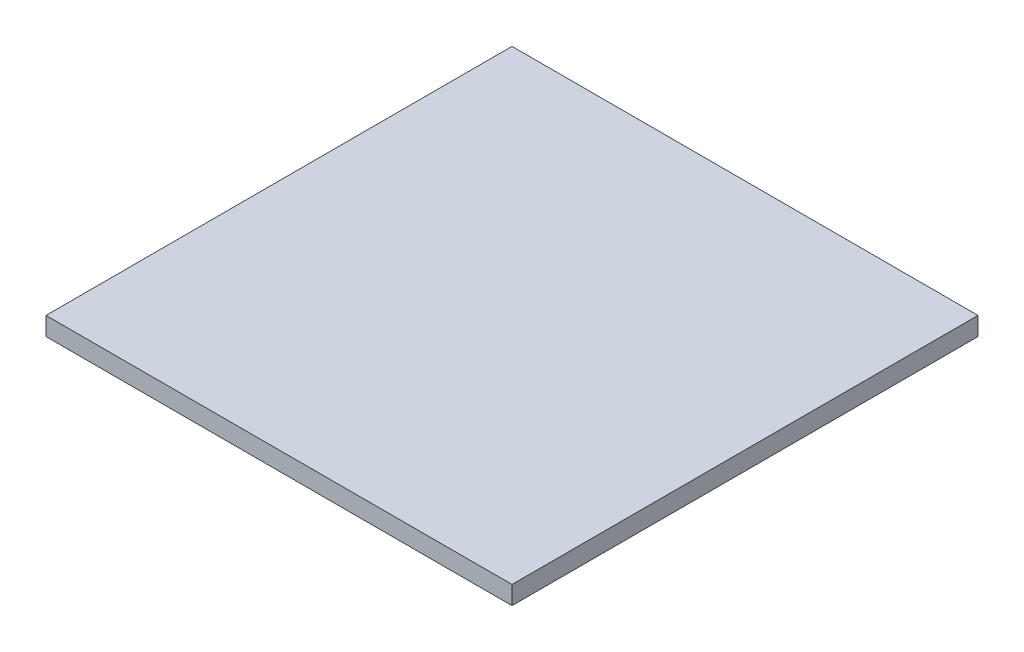
ISO-10303-21;
HEADER;
FILE_DESCRIPTION(('STEP AP214'),'2;1');
FILE_NAME('part.step','',(''),(''),'','','');
FILE_SCHEMA(('AUTOMOTIVE_DESIGN { 1 0 10303 214 1 1 1 1 }'));
ENDSEC;
DATA;
#1=APPLICATION_CONTEXT('core data for automotive mechanical design processes');
#2=APPLICATION_PROTOCOL_DEFINITION('international standard','automotive_design',2000,#1);
#3=PRODUCT_CONTEXT('',#1,'mechanical');
#4=PRODUCT('Part','Part','',(#3));
#5=PRODUCT_RELATED_PRODUCT_CATEGORY('part','',(#4));
#6=PRODUCT_DEFINITION_FORMATION('','',#4);
#7=PRODUCT_DEFINITION_CONTEXT('part definition',#1,'design');
#8=PRODUCT_DEFINITION('design','',#6,#7);
#9=PRODUCT_DEFINITION_SHAPE('','',#8);
#10=(LENGTH_UNIT() NAMED_UNIT(*) SI_UNIT(.MILLI.,.METRE.));
#11=(NAMED_UNIT(*) PLANE_ANGLE_UNIT() SI_UNIT($,.RADIAN.));
#12=(NAMED_UNIT(*) SI_UNIT($,.STERADIAN.) SOLID_ANGLE_UNIT());
#13=UNCERTAINTY_MEASURE_WITH_UNIT(LENGTH_MEASURE(1.E-05),#10,'distance_accuracy_value','');
#14=(GEOMETRIC_REPRESENTATION_CONTEXT(3) GLOBAL_UNCERTAINTY_ASSIGNED_CONTEXT((#13)) GLOBAL_UNIT_ASSIGNED_CONTEXT((#10,
#11,#12)) REPRESENTATION_CONTEXT('',''));
#15=CARTESIAN_POINT('',(0.,0.,0.));
#16=DIRECTION('',(0.,0.,1.));
#17=DIRECTION('',(1.,0.,0.));
#18=AXIS2_PLACEMENT_3D('',#15,#16,#17);
#19=CARTESIAN_POINT('',(38.1,-3.,38.1));
#20=DIRECTION('',(1.,0.,0.));
#21=DIRECTION('',(0.,0.,-1.));
#22=AXIS2_PLACEMENT_3D('',#19,#20,#21);
#23=PLANE('',#22);
#24=DIRECTION('',(0.,0.,-1.));
#25=VECTOR('',#24,1.);
#26=CARTESIAN_POINT('',(38.1,0.,38.1));
#27=LINE('',#26,#25);
#28=CARTESIAN_POINT('',(38.1,0.,38.1));
#29=VERTEX_POINT('',#28);
#30=CARTESIAN_POINT('',(38.1,0.,-38.1));
#31=VERTEX_POINT('',#30);
#32=EDGE_CURVE('E103',#29,#31,#27,.T.);
#33=ORIENTED_EDGE('',*,*,#32,.F.);
#34=DIRECTION('',(0.,1.,0.));
#35=VECTOR('',#34,1.);
#36=CARTESIAN_POINT('',(38.1,-3.,38.1));
#37=LINE('',#36,#35);
#38=CARTESIAN_POINT('',(38.1,-3.,38.1));
#39=VERTEX_POINT('',#38);
#40=EDGE_CURVE('E11',#39,#29,#37,.T.);
#41=ORIENTED_EDGE('',*,*,#40,.F.);
#42=DIRECTION('',(0.,0.,-1.));
#43=VECTOR('',#42,1.);
#44=CARTESIAN_POINT('',(38.1,-3.,38.1));
#45=LINE('',#44,#43);
#46=CARTESIAN_POINT('',(38.1,-3.,-38.1));
#47=VERTEX_POINT('',#46);
#48=EDGE_CURVE('E97',#39,#47,#45,.T.);
#49=ORIENTED_EDGE('',*,*,#48,.T.);
#50=DIRECTION('',(0.,1.,0.));
#51=VECTOR('',#50,1.);
#52=CARTESIAN_POINT('',(38.1,-3.,-38.1));
#53=LINE('',#52,#51);
#54=EDGE_CURVE('E42',#47,#31,#53,.T.);
#55=ORIENTED_EDGE('',*,*,#54,.T.);
#56=EDGE_LOOP('',(#33,#41,#49,#55));
#57=FACE_BOUND('',#56,.T.);
#58=ADVANCED_FACE('F39',(#57),#23,.T.);
#59=CARTESIAN_POINT('',(-38.1,-3.,38.1));
#60=DIRECTION('',(0.,0.,1.));
#61=DIRECTION('',(1.,0.,0.));
#62=AXIS2_PLACEMENT_3D('',#59,#60,#61);
#63=PLANE('',#62);
#64=DIRECTION('',(1.,0.,0.));
#65=VECTOR('',#64,1.);
#66=CARTESIAN_POINT('',(-38.1,0.,38.1));
#67=LINE('',#66,#65);
#68=CARTESIAN_POINT('',(-38.1,0.,38.1));
#69=VERTEX_POINT('',#68);
#70=EDGE_CURVE('E99',#69,#29,#67,.T.);
#71=ORIENTED_EDGE('',*,*,#70,.F.);
#72=DIRECTION('',(0.,1.,0.));
#73=VECTOR('',#72,1.);
#74=CARTESIAN_POINT('',(-38.1,-3.,38.1));
#75=LINE('',#74,#73);
#76=CARTESIAN_POINT('',(-38.1,-3.,38.1));
#77=VERTEX_POINT('',#76);
#78=EDGE_CURVE('E48',#77,#69,#75,.T.);
#79=ORIENTED_EDGE('',*,*,#78,.F.);
#80=DIRECTION('',(1.,0.,0.));
#81=VECTOR('',#80,1.);
#82=CARTESIAN_POINT('',(-38.1,-3.,38.1));
#83=LINE('',#82,#81);
#84=EDGE_CURVE('E94',#77,#39,#83,.T.);
#85=ORIENTED_EDGE('',*,*,#84,.T.);
#86=ORIENTED_EDGE('',*,*,#40,.T.);
#87=EDGE_LOOP('',(#71,#79,#85,#86));
#88=FACE_BOUND('',#87,.T.);
#89=ADVANCED_FACE('F113',(#88),#63,.T.);
#90=CARTESIAN_POINT('',(-38.1,-3.,38.1));
#91=DIRECTION('',(-1.,0.,0.));
#92=DIRECTION('',(0.,0.,1.));
#93=AXIS2_PLACEMENT_3D('',#90,#91,#92);
#94=PLANE('',#93);
#95=DIRECTION('',(0.,0.,1.));
#96=VECTOR('',#95,1.);
#97=CARTESIAN_POINT('',(-38.1,0.,38.1));
#98=LINE('',#97,#96);
#99=CARTESIAN_POINT('',(-38.1,0.,-38.1));
#100=VERTEX_POINT('',#99);
#101=EDGE_CURVE('E89',#100,#69,#98,.T.);
#102=ORIENTED_EDGE('',*,*,#101,.F.);
#103=DIRECTION('',(0.,1.,0.));
#104=VECTOR('',#103,1.);
#105=CARTESIAN_POINT('',(-38.1,-3.,-38.1));
#106=LINE('',#105,#104);
#107=CARTESIAN_POINT('',(-38.1,-3.,-38.1));
#108=VERTEX_POINT('',#107);
#109=EDGE_CURVE('E84',#108,#100,#106,.T.);
#110=ORIENTED_EDGE('',*,*,#109,.F.);
#111=DIRECTION('',(0.,0.,1.));
#112=VECTOR('',#111,1.);
#113=CARTESIAN_POINT('',(-38.1,-3.,38.1));
#114=LINE('',#113,#112);
#115=EDGE_CURVE('E87',#108,#77,#114,.T.);
#116=ORIENTED_EDGE('',*,*,#115,.T.);
#117=ORIENTED_EDGE('',*,*,#78,.T.);
#118=EDGE_LOOP('',(#102,#110,#116,#117));
#119=FACE_BOUND('',#118,.T.);
#120=ADVANCED_FACE('F86',(#119),#94,.T.);
#121=CARTESIAN_POINT('',(-38.1,-3.,-38.1));
#122=DIRECTION('',(0.,0.,-1.));
#123=DIRECTION('',(-1.,0.,0.));
#124=AXIS2_PLACEMENT_3D('',#121,#122,#123);
#125=PLANE('',#124);
#126=DIRECTION('',(-1.,0.,0.));
#127=VECTOR('',#126,1.);
#128=CARTESIAN_POINT('',(-38.1,0.,-38.1));
#129=LINE('',#128,#127);
#130=EDGE_CURVE('E106',#31,#100,#129,.T.);
#131=ORIENTED_EDGE('',*,*,#130,.F.);
#132=ORIENTED_EDGE('',*,*,#54,.F.);
#133=DIRECTION('',(-1.,0.,0.));
#134=VECTOR('',#133,1.);
#135=CARTESIAN_POINT('',(-38.1,-3.,-38.1));
#136=LINE('',#135,#134);
#137=EDGE_CURVE('E93',#47,#108,#136,.T.);
#138=ORIENTED_EDGE('',*,*,#137,.T.);
#139=ORIENTED_EDGE('',*,*,#109,.T.);
#140=EDGE_LOOP('',(#131,#132,#138,#139));
#141=FACE_BOUND('',#140,.T.);
#142=ADVANCED_FACE('F96',(#141),#125,.T.);
#143=CARTESIAN_POINT('',(0.,-3.,0.));
#144=DIRECTION('',(0.,-1.,0.));
#145=DIRECTION('',(0.,0.,-1.));
#146=AXIS2_PLACEMENT_3D('',#143,#144,#145);
#147=PLANE('',#146);
#148=ORIENTED_EDGE('',*,*,#48,.F.);
#149=ORIENTED_EDGE('',*,*,#84,.F.);
#150=ORIENTED_EDGE('',*,*,#115,.F.);
#151=ORIENTED_EDGE('',*,*,#137,.F.);
#152=EDGE_LOOP('',(#148,#149,#150,#151));
#153=FACE_BOUND('',#152,.T.);
#154=ADVANCED_FACE('F92',(#153),#147,.T.);
#155=CARTESIAN_POINT('',(0.,0.,0.));
#156=DIRECTION('',(0.,-1.,0.));
#157=DIRECTION('',(0.,0.,-1.));
#158=AXIS2_PLACEMENT_3D('',#155,#156,#157);
#159=PLANE('',#158);
#160=ORIENTED_EDGE('',*,*,#32,.T.);
#161=ORIENTED_EDGE('',*,*,#130,.T.);
#162=ORIENTED_EDGE('',*,*,#101,.T.);
#163=ORIENTED_EDGE('',*,*,#70,.T.);
#164=EDGE_LOOP('',(#160,#161,#162,#163));
#165=FACE_BOUND('',#164,.T.);
#166=ADVANCED_FACE('F112',(#165),#159,.F.);
#167=CLOSED_SHELL('',(#58,#89,#120,#142,#154,#166));
#168=MANIFOLD_SOLID_BREP('B2',#167);
#169=ADVANCED_BREP_SHAPE_REPRESENTATION('',(#18,#168),#14);
#170=SHAPE_DEFINITION_REPRESENTATION(#9,#169);
ENDSEC;
END-ISO-10303-21;
